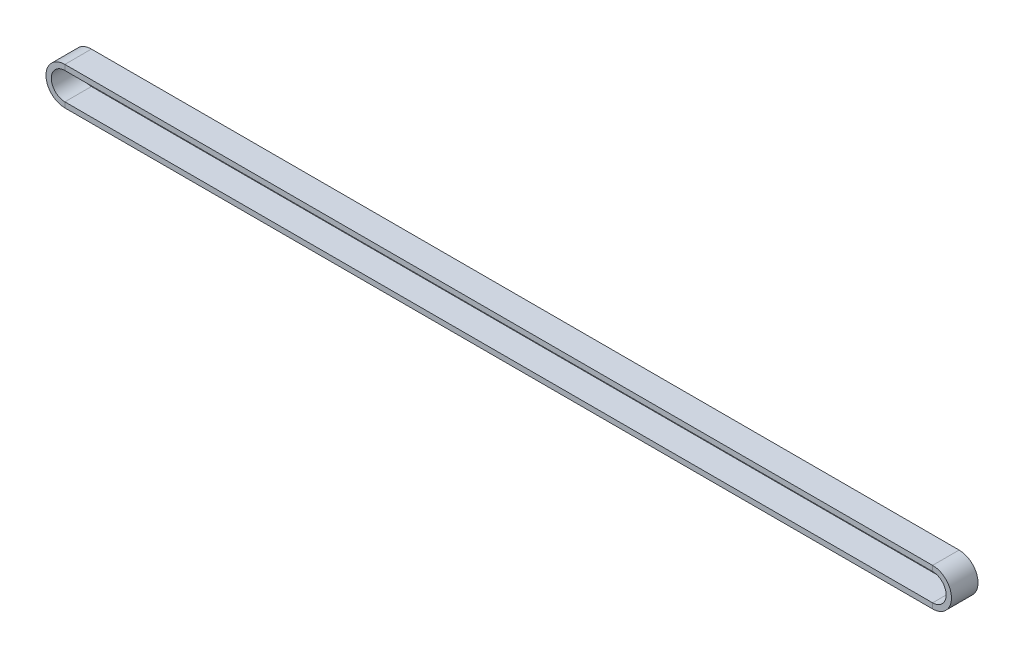
ISO-10303-21;
HEADER;
FILE_DESCRIPTION(('STEP AP214'),'2;1');
FILE_NAME('part.step','',(''),(''),'','','');
FILE_SCHEMA(('AUTOMOTIVE_DESIGN { 1 0 10303 214 1 1 1 1 }'));
ENDSEC;
DATA;
#1=APPLICATION_CONTEXT('core data for automotive mechanical design processes');
#2=APPLICATION_PROTOCOL_DEFINITION('international standard','automotive_design',2000,#1);
#3=PRODUCT_CONTEXT('',#1,'mechanical');
#4=PRODUCT('Part','Part','',(#3));
#5=PRODUCT_RELATED_PRODUCT_CATEGORY('part','',(#4));
#6=PRODUCT_DEFINITION_FORMATION('','',#4);
#7=PRODUCT_DEFINITION_CONTEXT('part definition',#1,'design');
#8=PRODUCT_DEFINITION('design','',#6,#7);
#9=PRODUCT_DEFINITION_SHAPE('','',#8);
#10=(LENGTH_UNIT() NAMED_UNIT(*) SI_UNIT(.MILLI.,.METRE.));
#11=(NAMED_UNIT(*) PLANE_ANGLE_UNIT() SI_UNIT($,.RADIAN.));
#12=(NAMED_UNIT(*) SI_UNIT($,.STERADIAN.) SOLID_ANGLE_UNIT());
#13=UNCERTAINTY_MEASURE_WITH_UNIT(LENGTH_MEASURE(1.E-05),#10,'distance_accuracy_value','');
#14=(GEOMETRIC_REPRESENTATION_CONTEXT(3) GLOBAL_UNCERTAINTY_ASSIGNED_CONTEXT((#13)) GLOBAL_UNIT_ASSIGNED_CONTEXT((#10,
#11,#12)) REPRESENTATION_CONTEXT('',''));
#15=CARTESIAN_POINT('',(0.,0.,0.));
#16=DIRECTION('',(0.,0.,1.));
#17=DIRECTION('',(1.,0.,0.));
#18=AXIS2_PLACEMENT_3D('',#15,#16,#17);
#19=CARTESIAN_POINT('',(5.95230892805693E-12,19.8877968990083,-5.));
#20=DIRECTION('',(0.,0.,1.));
#21=DIRECTION('',(1.,0.,0.));
#22=AXIS2_PLACEMENT_3D('',#19,#20,#21);
#23=PLANE('',#22);
#24=DIRECTION('',(0.,-1.,0.));
#25=VECTOR('',#24,1.);
#26=CARTESIAN_POINT('',(5.99780076730127E-12,19.8877968990083,-5.));
#27=LINE('',#26,#25);
#28=CARTESIAN_POINT('',(5.99520433297585E-12,19.8877968990083,-5.));
#29=VERTEX_POINT('',#28);
#30=CARTESIAN_POINT('',(5.99520433297585E-12,17.8877968990083,-5.));
#31=VERTEX_POINT('',#30);
#32=EDGE_CURVE('E148',#29,#31,#27,.T.);
#33=ORIENTED_EDGE('',*,*,#32,.F.);
#34=CARTESIAN_POINT('',(2.99760216648792E-12,24.9999999999858,-5.));
#35=DIRECTION('',(0.,0.,1.));
#36=DIRECTION('',(5.77971317494023E-13,-1.,0.));
#37=AXIS2_PLACEMENT_3D('',#34,#35,#36);
#38=CIRCLE('',#37,5.11220310097753);
#39=CARTESIAN_POINT('',(0.,30.1122031009633,-5.));
#40=VERTEX_POINT('',#39);
#41=EDGE_CURVE('E147',#29,#40,#38,.T.);
#42=ORIENTED_EDGE('',*,*,#41,.T.);
#43=DIRECTION('',(0.,1.,0.));
#44=VECTOR('',#43,1.);
#45=CARTESIAN_POINT('',(0.,30.1122031009633,-5.));
#46=LINE('',#45,#44);
#47=CARTESIAN_POINT('',(0.,32.1122031009633,-5.));
#48=VERTEX_POINT('',#47);
#49=EDGE_CURVE('E126',#40,#48,#46,.T.);
#50=ORIENTED_EDGE('',*,*,#49,.T.);
#51=CARTESIAN_POINT('',(2.99760216648792E-12,24.9999999999858,-5.));
#52=DIRECTION('',(0.,0.,1.));
#53=DIRECTION('',(4.2834979823753E-13,-1.,0.));
#54=AXIS2_PLACEMENT_3D('',#51,#52,#53);
#55=CIRCLE('',#54,7.11220310097753);
#56=EDGE_CURVE('E152',#31,#48,#55,.T.);
#57=ORIENTED_EDGE('',*,*,#56,.F.);
#58=EDGE_LOOP('',(#33,#42,#50,#57));
#59=FACE_BOUND('',#58,.T.);
#60=ADVANCED_FACE('F32',(#59),#23,.F.);
#61=CARTESIAN_POINT('',(0.,30.1122031009633,-5.));
#62=DIRECTION('',(0.,0.,1.));
#63=DIRECTION('',(1.,0.,0.));
#64=AXIS2_PLACEMENT_3D('',#61,#62,#63);
#65=PLANE('',#64);
#66=DIRECTION('',(-1.,0.,0.));
#67=VECTOR('',#66,1.);
#68=CARTESIAN_POINT('',(0.,32.1122031009633,-5.));
#69=LINE('',#68,#67);
#70=CARTESIAN_POINT('',(-327.000000000011,32.1122031009633,-5.));
#71=VERTEX_POINT('',#70);
#72=EDGE_CURVE('E116',#48,#71,#69,.T.);
#73=ORIENTED_EDGE('',*,*,#72,.F.);
#74=ORIENTED_EDGE('',*,*,#49,.F.);
#75=DIRECTION('',(-1.,0.,0.));
#76=VECTOR('',#75,1.);
#77=CARTESIAN_POINT('',(0.,30.1122031009633,-5.));
#78=LINE('',#77,#76);
#79=CARTESIAN_POINT('',(-327.000000000011,30.1122031009633,-5.));
#80=VERTEX_POINT('',#79);
#81=EDGE_CURVE('E129',#40,#80,#78,.T.);
#82=ORIENTED_EDGE('',*,*,#81,.T.);
#83=DIRECTION('',(0.,1.,0.));
#84=VECTOR('',#83,1.);
#85=CARTESIAN_POINT('',(-327.000000000011,30.1122031009633,-5.));
#86=LINE('',#85,#84);
#87=EDGE_CURVE('E144',#80,#71,#86,.T.);
#88=ORIENTED_EDGE('',*,*,#87,.T.);
#89=EDGE_LOOP('',(#73,#74,#82,#88));
#90=FACE_BOUND('',#89,.T.);
#91=ADVANCED_FACE('F128',(#90),#65,.F.);
#92=CARTESIAN_POINT('',(0.,32.1122031009633,-5.));
#93=DIRECTION('',(0.,-1.,0.));
#94=DIRECTION('',(0.,0.,-1.));
#95=AXIS2_PLACEMENT_3D('',#92,#93,#94);
#96=PLANE('',#95);
#97=DIRECTION('',(-1.,0.,0.));
#98=VECTOR('',#97,1.);
#99=CARTESIAN_POINT('',(0.,32.1122031009633,5.));
#100=LINE('',#99,#98);
#101=CARTESIAN_POINT('',(0.,32.1122031009633,5.));
#102=VERTEX_POINT('',#101);
#103=CARTESIAN_POINT('',(-327.000000000011,32.1122031009633,5.));
#104=VERTEX_POINT('',#103);
#105=EDGE_CURVE('E110',#102,#104,#100,.T.);
#106=ORIENTED_EDGE('',*,*,#105,.F.);
#107=DIRECTION('',(0.,0.,1.));
#108=VECTOR('',#107,1.);
#109=CARTESIAN_POINT('',(0.,32.1122031009633,-5.));
#110=LINE('',#109,#108);
#111=EDGE_CURVE('E134',#48,#102,#110,.T.);
#112=ORIENTED_EDGE('',*,*,#111,.F.);
#113=ORIENTED_EDGE('',*,*,#72,.T.);
#114=DIRECTION('',(0.,0.,1.));
#115=VECTOR('',#114,1.);
#116=CARTESIAN_POINT('',(-327.000000000011,32.1122031009633,-5.));
#117=LINE('',#116,#115);
#118=EDGE_CURVE('E192',#71,#104,#117,.T.);
#119=ORIENTED_EDGE('',*,*,#118,.T.);
#120=EDGE_LOOP('',(#106,#112,#113,#119));
#121=FACE_BOUND('',#120,.T.);
#122=ADVANCED_FACE('F211',(#121),#96,.F.);
#123=CARTESIAN_POINT('',(0.,30.1122031009633,5.));
#124=DIRECTION('',(0.,0.,-1.));
#125=DIRECTION('',(-1.,0.,0.));
#126=AXIS2_PLACEMENT_3D('',#123,#124,#125);
#127=PLANE('',#126);
#128=DIRECTION('',(-1.,0.,0.));
#129=VECTOR('',#128,1.);
#130=CARTESIAN_POINT('',(0.,30.1122031009633,5.));
#131=LINE('',#130,#129);
#132=CARTESIAN_POINT('',(0.,30.1122031009633,5.));
#133=VERTEX_POINT('',#132);
#134=CARTESIAN_POINT('',(-327.000000000011,30.1122031009633,5.));
#135=VERTEX_POINT('',#134);
#136=EDGE_CURVE('E162',#133,#135,#131,.T.);
#137=ORIENTED_EDGE('',*,*,#136,.F.);
#138=DIRECTION('',(0.,1.,0.));
#139=VECTOR('',#138,1.);
#140=CARTESIAN_POINT('',(0.,30.1122031009633,5.));
#141=LINE('',#140,#139);
#142=EDGE_CURVE('E155',#102,#133,#141,.F.);
#143=ORIENTED_EDGE('',*,*,#142,.F.);
#144=ORIENTED_EDGE('',*,*,#105,.T.);
#145=DIRECTION('',(0.,1.,0.));
#146=VECTOR('',#145,1.);
#147=CARTESIAN_POINT('',(-327.000000000011,30.1122031009633,5.));
#148=LINE('',#147,#146);
#149=EDGE_CURVE('E180',#104,#135,#148,.F.);
#150=ORIENTED_EDGE('',*,*,#149,.T.);
#151=EDGE_LOOP('',(#137,#143,#144,#150));
#152=FACE_BOUND('',#151,.T.);
#153=ADVANCED_FACE('F179',(#152),#127,.F.);
#154=CARTESIAN_POINT('',(0.,30.1122031009633,-5.));
#155=DIRECTION('',(0.,1.,0.));
#156=DIRECTION('',(0.,0.,1.));
#157=AXIS2_PLACEMENT_3D('',#154,#155,#156);
#158=PLANE('',#157);
#159=DIRECTION('',(0.,0.,1.));
#160=VECTOR('',#159,1.);
#161=CARTESIAN_POINT('',(-327.000000000011,30.1122031009633,-5.));
#162=LINE('',#161,#160);
#163=EDGE_CURVE('E142',#135,#80,#162,.F.);
#164=ORIENTED_EDGE('',*,*,#163,.T.);
#165=ORIENTED_EDGE('',*,*,#81,.F.);
#166=DIRECTION('',(0.,0.,1.));
#167=VECTOR('',#166,1.);
#168=CARTESIAN_POINT('',(0.,30.1122031009633,-5.));
#169=LINE('',#168,#167);
#170=EDGE_CURVE('E141',#133,#40,#169,.F.);
#171=ORIENTED_EDGE('',*,*,#170,.F.);
#172=ORIENTED_EDGE('',*,*,#136,.T.);
#173=EDGE_LOOP('',(#164,#165,#171,#172));
#174=FACE_BOUND('',#173,.T.);
#175=ADVANCED_FACE('F139',(#174),#158,.F.);
#176=CARTESIAN_POINT('',(-327.00000000001,30.1122031009633,-5.));
#177=DIRECTION('',(0.,0.,1.));
#178=DIRECTION('',(1.,0.,0.));
#179=AXIS2_PLACEMENT_3D('',#176,#177,#178);
#180=PLANE('',#179);
#181=CARTESIAN_POINT('',(-327.000000000008,24.9999999999858,-5.));
#182=DIRECTION('',(0.,0.,1.));
#183=DIRECTION('',(-2.26346655579228E-13,1.,0.));
#184=AXIS2_PLACEMENT_3D('',#181,#182,#183);
#185=CIRCLE('',#184,7.11220310097753);
#186=CARTESIAN_POINT('',(-327.000000000005,17.8877968990083,-5.));
#187=VERTEX_POINT('',#186);
#188=EDGE_CURVE('E97',#71,#187,#185,.T.);
#189=ORIENTED_EDGE('',*,*,#188,.F.);
#190=ORIENTED_EDGE('',*,*,#87,.F.);
#191=CARTESIAN_POINT('',(-327.000000000008,24.9999999999858,-5.));
#192=DIRECTION('',(0.,0.,1.));
#193=DIRECTION('',(-3.14898166975928E-13,1.,0.));
#194=AXIS2_PLACEMENT_3D('',#191,#192,#193);
#195=CIRCLE('',#194,5.11220310097753);
#196=CARTESIAN_POINT('',(-327.000000000005,19.8877968990083,-5.));
#197=VERTEX_POINT('',#196);
#198=EDGE_CURVE('E161',#80,#197,#195,.T.);
#199=ORIENTED_EDGE('',*,*,#198,.T.);
#200=DIRECTION('',(0.,-1.,0.));
#201=VECTOR('',#200,1.);
#202=CARTESIAN_POINT('',(-327.000000000005,19.8877968990083,-5.));
#203=LINE('',#202,#201);
#204=EDGE_CURVE('E202',#197,#187,#203,.T.);
#205=ORIENTED_EDGE('',*,*,#204,.T.);
#206=EDGE_LOOP('',(#189,#190,#199,#205));
#207=FACE_BOUND('',#206,.T.);
#208=ADVANCED_FACE('F207',(#207),#180,.F.);
#209=CARTESIAN_POINT('',(-327.000000000008,24.9999999999858,0.));
#210=DIRECTION('',(0.,0.,1.));
#211=DIRECTION('',(1.,0.,0.));
#212=AXIS2_PLACEMENT_3D('',#209,#210,#211);
#213=CYLINDRICAL_SURFACE('',#212,7.11220310097753);
#214=CARTESIAN_POINT('',(-327.000000000008,24.9999999999858,5.));
#215=DIRECTION('',(0.,0.,1.));
#216=DIRECTION('',(-2.26346655579228E-13,1.,0.));
#217=AXIS2_PLACEMENT_3D('',#214,#215,#216);
#218=CIRCLE('',#217,7.11220310097753);
#219=CARTESIAN_POINT('',(-327.000000000005,17.8877968990083,5.));
#220=VERTEX_POINT('',#219);
#221=EDGE_CURVE('E90',#104,#220,#218,.T.);
#222=ORIENTED_EDGE('',*,*,#221,.F.);
#223=ORIENTED_EDGE('',*,*,#118,.F.);
#224=ORIENTED_EDGE('',*,*,#188,.T.);
#225=DIRECTION('',(0.,0.,1.));
#226=VECTOR('',#225,1.);
#227=CARTESIAN_POINT('',(-327.000000000005,17.8877968990083,-5.));
#228=LINE('',#227,#226);
#229=EDGE_CURVE('E189',#187,#220,#228,.T.);
#230=ORIENTED_EDGE('',*,*,#229,.T.);
#231=EDGE_LOOP('',(#222,#223,#224,#230));
#232=FACE_BOUND('',#231,.T.);
#233=ADVANCED_FACE('F210',(#232),#213,.T.);
#234=CARTESIAN_POINT('',(-327.00000000001,30.1122031009633,5.));
#235=DIRECTION('',(0.,0.,-1.));
#236=DIRECTION('',(-1.,0.,0.));
#237=AXIS2_PLACEMENT_3D('',#234,#235,#236);
#238=PLANE('',#237);
#239=CARTESIAN_POINT('',(-327.000000000008,24.9999999999858,5.));
#240=DIRECTION('',(0.,0.,1.));
#241=DIRECTION('',(-3.14898166975928E-13,1.,0.));
#242=AXIS2_PLACEMENT_3D('',#239,#240,#241);
#243=CIRCLE('',#242,5.11220310097753);
#244=CARTESIAN_POINT('',(-327.000000000005,19.8877968990083,5.));
#245=VERTEX_POINT('',#244);
#246=EDGE_CURVE('E81',#135,#245,#243,.T.);
#247=ORIENTED_EDGE('',*,*,#246,.F.);
#248=ORIENTED_EDGE('',*,*,#149,.F.);
#249=ORIENTED_EDGE('',*,*,#221,.T.);
#250=DIRECTION('',(0.,-1.,0.));
#251=VECTOR('',#250,1.);
#252=CARTESIAN_POINT('',(-327.000000000005,19.8877968990083,5.));
#253=LINE('',#252,#251);
#254=EDGE_CURVE('E167',#220,#245,#253,.F.);
#255=ORIENTED_EDGE('',*,*,#254,.T.);
#256=EDGE_LOOP('',(#247,#248,#249,#255));
#257=FACE_BOUND('',#256,.T.);
#258=ADVANCED_FACE('F229',(#257),#238,.F.);
#259=CARTESIAN_POINT('',(-327.000000000008,24.9999999999858,0.));
#260=DIRECTION('',(0.,0.,1.));
#261=DIRECTION('',(1.,0.,0.));
#262=AXIS2_PLACEMENT_3D('',#259,#260,#261);
#263=CYLINDRICAL_SURFACE('',#262,5.11220310097753);
#264=DIRECTION('',(0.,0.,1.));
#265=VECTOR('',#264,1.);
#266=CARTESIAN_POINT('',(-327.000000000005,19.8877968990083,-5.));
#267=LINE('',#266,#265);
#268=EDGE_CURVE('E163',#245,#197,#267,.F.);
#269=ORIENTED_EDGE('',*,*,#268,.T.);
#270=ORIENTED_EDGE('',*,*,#198,.F.);
#271=ORIENTED_EDGE('',*,*,#163,.F.);
#272=ORIENTED_EDGE('',*,*,#246,.T.);
#273=EDGE_LOOP('',(#269,#270,#271,#272));
#274=FACE_BOUND('',#273,.T.);
#275=ADVANCED_FACE('F221',(#274),#263,.F.);
#276=CARTESIAN_POINT('',(-327.000000000005,19.8877968990083,-5.));
#277=DIRECTION('',(0.,0.,1.));
#278=DIRECTION('',(1.,0.,0.));
#279=AXIS2_PLACEMENT_3D('',#276,#277,#278);
#280=PLANE('',#279);
#281=DIRECTION('',(1.,0.,0.));
#282=VECTOR('',#281,1.);
#283=CARTESIAN_POINT('',(-327.000000000005,17.8877968990083,-5.));
#284=LINE('',#283,#282);
#285=EDGE_CURVE('E187',#187,#31,#284,.T.);
#286=ORIENTED_EDGE('',*,*,#285,.F.);
#287=ORIENTED_EDGE('',*,*,#204,.F.);
#288=DIRECTION('',(1.,0.,0.));
#289=VECTOR('',#288,1.);
#290=CARTESIAN_POINT('',(-327.000000000005,19.8877968990083,-5.));
#291=LINE('',#290,#289);
#292=EDGE_CURVE('E164',#197,#29,#291,.T.);
#293=ORIENTED_EDGE('',*,*,#292,.T.);
#294=ORIENTED_EDGE('',*,*,#32,.T.);
#295=EDGE_LOOP('',(#286,#287,#293,#294));
#296=FACE_BOUND('',#295,.T.);
#297=ADVANCED_FACE('F219',(#296),#280,.F.);
#298=CARTESIAN_POINT('',(-327.000000000005,17.8877968990083,-5.));
#299=DIRECTION('',(0.,1.,0.));
#300=DIRECTION('',(0.,0.,1.));
#301=AXIS2_PLACEMENT_3D('',#298,#299,#300);
#302=PLANE('',#301);
#303=DIRECTION('',(1.,0.,0.));
#304=VECTOR('',#303,1.);
#305=CARTESIAN_POINT('',(-327.000000000005,17.8877968990083,5.));
#306=LINE('',#305,#304);
#307=CARTESIAN_POINT('',(5.99520433297585E-12,17.8877968990083,5.));
#308=VERTEX_POINT('',#307);
#309=EDGE_CURVE('E57',#220,#308,#306,.T.);
#310=ORIENTED_EDGE('',*,*,#309,.F.);
#311=ORIENTED_EDGE('',*,*,#229,.F.);
#312=ORIENTED_EDGE('',*,*,#285,.T.);
#313=DIRECTION('',(0.,0.,1.));
#314=VECTOR('',#313,1.);
#315=CARTESIAN_POINT('',(5.99780076730127E-12,17.8877968990083,-5.));
#316=LINE('',#315,#314);
#317=EDGE_CURVE('E185',#31,#308,#316,.T.);
#318=ORIENTED_EDGE('',*,*,#317,.T.);
#319=EDGE_LOOP('',(#310,#311,#312,#318));
#320=FACE_BOUND('',#319,.T.);
#321=ADVANCED_FACE('F216',(#320),#302,.F.);
#322=CARTESIAN_POINT('',(-327.000000000005,19.8877968990083,5.));
#323=DIRECTION('',(0.,0.,-1.));
#324=DIRECTION('',(-1.,0.,0.));
#325=AXIS2_PLACEMENT_3D('',#322,#323,#324);
#326=PLANE('',#325);
#327=DIRECTION('',(1.,0.,0.));
#328=VECTOR('',#327,1.);
#329=CARTESIAN_POINT('',(-327.000000000005,19.8877968990083,5.));
#330=LINE('',#329,#328);
#331=CARTESIAN_POINT('',(5.99520433297585E-12,19.8877968990083,5.));
#332=VERTEX_POINT('',#331);
#333=EDGE_CURVE('E49',#245,#332,#330,.T.);
#334=ORIENTED_EDGE('',*,*,#333,.F.);
#335=ORIENTED_EDGE('',*,*,#254,.F.);
#336=ORIENTED_EDGE('',*,*,#309,.T.);
#337=DIRECTION('',(0.,-1.,0.));
#338=VECTOR('',#337,1.);
#339=CARTESIAN_POINT('',(5.99780076730127E-12,19.8877968990083,5.));
#340=LINE('',#339,#338);
#341=EDGE_CURVE('E172',#308,#332,#340,.F.);
#342=ORIENTED_EDGE('',*,*,#341,.T.);
#343=EDGE_LOOP('',(#334,#335,#336,#342));
#344=FACE_BOUND('',#343,.T.);
#345=ADVANCED_FACE('F227',(#344),#326,.F.);
#346=CARTESIAN_POINT('',(-327.000000000005,19.8877968990083,-5.));
#347=DIRECTION('',(0.,-1.,0.));
#348=DIRECTION('',(0.,0.,-1.));
#349=AXIS2_PLACEMENT_3D('',#346,#347,#348);
#350=PLANE('',#349);
#351=DIRECTION('',(0.,0.,1.));
#352=VECTOR('',#351,1.);
#353=CARTESIAN_POINT('',(5.99780076730127E-12,19.8877968990083,-5.));
#354=LINE('',#353,#352);
#355=EDGE_CURVE('E36',#332,#29,#354,.F.);
#356=ORIENTED_EDGE('',*,*,#355,.T.);
#357=ORIENTED_EDGE('',*,*,#292,.F.);
#358=ORIENTED_EDGE('',*,*,#268,.F.);
#359=ORIENTED_EDGE('',*,*,#333,.T.);
#360=EDGE_LOOP('',(#356,#357,#358,#359));
#361=FACE_BOUND('',#360,.T.);
#362=ADVANCED_FACE('F173',(#361),#350,.F.);
#363=CARTESIAN_POINT('',(2.99760216648792E-12,24.9999999999858,0.));
#364=DIRECTION('',(0.,0.,1.));
#365=DIRECTION('',(1.,0.,0.));
#366=AXIS2_PLACEMENT_3D('',#363,#364,#365);
#367=CYLINDRICAL_SURFACE('',#366,7.11220310097753);
#368=ORIENTED_EDGE('',*,*,#56,.T.);
#369=ORIENTED_EDGE('',*,*,#111,.T.);
#370=CARTESIAN_POINT('',(2.99760216648792E-12,24.9999999999858,5.));
#371=DIRECTION('',(0.,0.,1.));
#372=DIRECTION('',(4.2834979823753E-13,-1.,0.));
#373=AXIS2_PLACEMENT_3D('',#370,#371,#372);
#374=CIRCLE('',#373,7.11220310097753);
#375=EDGE_CURVE('E41',#308,#102,#374,.T.);
#376=ORIENTED_EDGE('',*,*,#375,.F.);
#377=ORIENTED_EDGE('',*,*,#317,.F.);
#378=EDGE_LOOP('',(#368,#369,#376,#377));
#379=FACE_BOUND('',#378,.T.);
#380=ADVANCED_FACE('F213',(#379),#367,.T.);
#381=CARTESIAN_POINT('',(5.95230892805693E-12,19.8877968990083,5.));
#382=DIRECTION('',(0.,0.,-1.));
#383=DIRECTION('',(-1.,0.,0.));
#384=AXIS2_PLACEMENT_3D('',#381,#382,#383);
#385=PLANE('',#384);
#386=ORIENTED_EDGE('',*,*,#375,.T.);
#387=ORIENTED_EDGE('',*,*,#142,.T.);
#388=CARTESIAN_POINT('',(2.99760216648792E-12,24.9999999999858,5.));
#389=DIRECTION('',(0.,0.,1.));
#390=DIRECTION('',(5.77971317494023E-13,-1.,0.));
#391=AXIS2_PLACEMENT_3D('',#388,#389,#390);
#392=CIRCLE('',#391,5.11220310097753);
#393=EDGE_CURVE('E11',#332,#133,#392,.T.);
#394=ORIENTED_EDGE('',*,*,#393,.F.);
#395=ORIENTED_EDGE('',*,*,#341,.F.);
#396=EDGE_LOOP('',(#386,#387,#394,#395));
#397=FACE_BOUND('',#396,.T.);
#398=ADVANCED_FACE('F177',(#397),#385,.F.);
#399=CARTESIAN_POINT('',(2.99760216648792E-12,24.9999999999858,0.));
#400=DIRECTION('',(0.,0.,1.));
#401=DIRECTION('',(1.,0.,0.));
#402=AXIS2_PLACEMENT_3D('',#399,#400,#401);
#403=CYLINDRICAL_SURFACE('',#402,5.11220310097753);
#404=ORIENTED_EDGE('',*,*,#393,.T.);
#405=ORIENTED_EDGE('',*,*,#170,.T.);
#406=ORIENTED_EDGE('',*,*,#41,.F.);
#407=ORIENTED_EDGE('',*,*,#355,.F.);
#408=EDGE_LOOP('',(#404,#405,#406,#407));
#409=FACE_BOUND('',#408,.T.);
#410=ADVANCED_FACE('F34',(#409),#403,.F.);
#411=CLOSED_SHELL('',(#60,#91,#122,#153,#175,#208,#233,#258,#275,#297,#321,#345,#362,#380,#398,#410));
#412=MANIFOLD_SOLID_BREP('B2',#411);
#413=ADVANCED_BREP_SHAPE_REPRESENTATION('',(#18,#412),#14);
#414=SHAPE_DEFINITION_REPRESENTATION(#9,#413);
ENDSEC;
END-ISO-10303-21;
